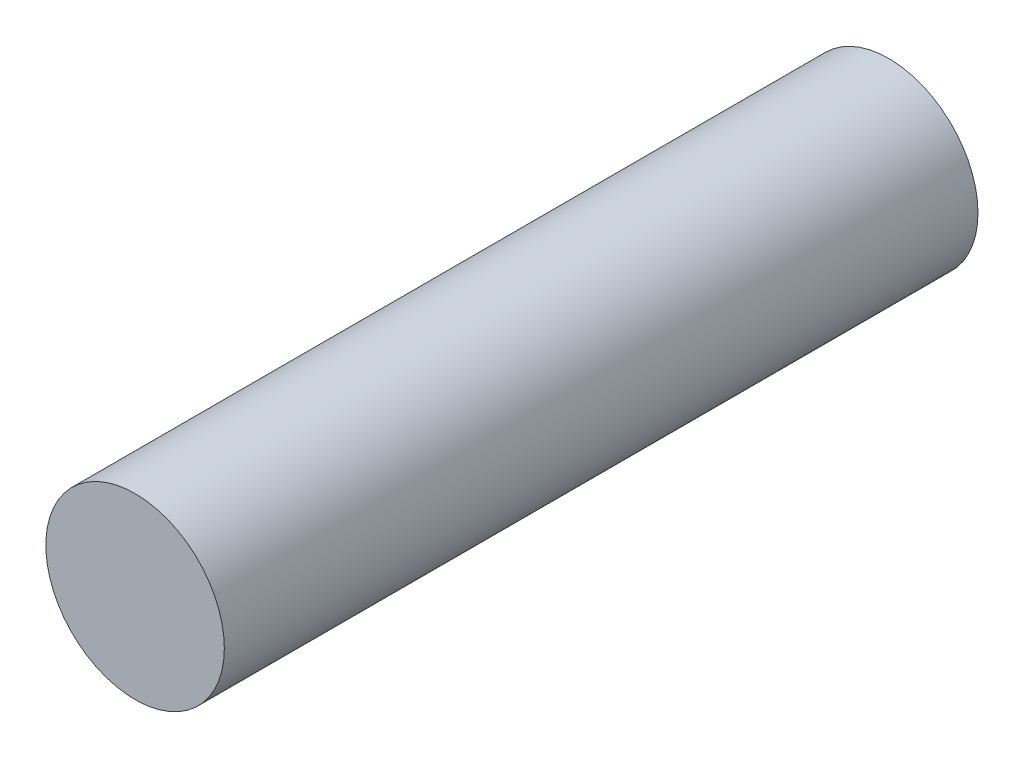
ISO-10303-21;
HEADER;
FILE_DESCRIPTION(('STEP AP214'),'2;1');
FILE_NAME('part.step','',(''),(''),'','','');
FILE_SCHEMA(('AUTOMOTIVE_DESIGN { 1 0 10303 214 1 1 1 1 }'));
ENDSEC;
DATA;
#1=APPLICATION_CONTEXT('core data for automotive mechanical design processes');
#2=APPLICATION_PROTOCOL_DEFINITION('international standard','automotive_design',2000,#1);
#3=PRODUCT_CONTEXT('',#1,'mechanical');
#4=PRODUCT('Part','Part','',(#3));
#5=PRODUCT_RELATED_PRODUCT_CATEGORY('part','',(#4));
#6=PRODUCT_DEFINITION_FORMATION('','',#4);
#7=PRODUCT_DEFINITION_CONTEXT('part definition',#1,'design');
#8=PRODUCT_DEFINITION('design','',#6,#7);
#9=PRODUCT_DEFINITION_SHAPE('','',#8);
#10=(LENGTH_UNIT() NAMED_UNIT(*) SI_UNIT(.MILLI.,.METRE.));
#11=(NAMED_UNIT(*) PLANE_ANGLE_UNIT() SI_UNIT($,.RADIAN.));
#12=(NAMED_UNIT(*) SI_UNIT($,.STERADIAN.) SOLID_ANGLE_UNIT());
#13=UNCERTAINTY_MEASURE_WITH_UNIT(LENGTH_MEASURE(1.E-05),#10,'distance_accuracy_value','');
#14=(GEOMETRIC_REPRESENTATION_CONTEXT(3) GLOBAL_UNCERTAINTY_ASSIGNED_CONTEXT((#13)) GLOBAL_UNIT_ASSIGNED_CONTEXT((#10,
#11,#12)) REPRESENTATION_CONTEXT('',''));
#15=CARTESIAN_POINT('',(0.,0.,0.));
#16=DIRECTION('',(0.,0.,1.));
#17=DIRECTION('',(1.,0.,0.));
#18=AXIS2_PLACEMENT_3D('',#15,#16,#17);
#19=CARTESIAN_POINT('',(0.,0.,76.));
#20=DIRECTION('',(0.,0.,-1.));
#21=DIRECTION('',(-1.,0.,0.));
#22=AXIS2_PLACEMENT_3D('',#19,#20,#21);
#23=CYLINDRICAL_SURFACE('',#22,9.);
#24=CARTESIAN_POINT('',(0.,0.,76.));
#25=DIRECTION('',(0.,0.,1.));
#26=DIRECTION('',(1.,0.,0.));
#27=AXIS2_PLACEMENT_3D('',#24,#25,#26);
#28=CIRCLE('',#27,9.);
#29=CARTESIAN_POINT('',(9.,0.,76.));
#30=VERTEX_POINT('',#29);
#31=EDGE_CURVE('E10',#30,#30,#28,.T.);
#32=ORIENTED_EDGE('',*,*,#31,.F.);
#33=EDGE_LOOP('',(#32));
#34=FACE_BOUND('',#33,.T.);
#35=CARTESIAN_POINT('',(0.,0.,0.));
#36=DIRECTION('',(0.,0.,1.));
#37=DIRECTION('',(1.,0.,0.));
#38=AXIS2_PLACEMENT_3D('',#35,#36,#37);
#39=CIRCLE('',#38,9.);
#40=CARTESIAN_POINT('',(9.,0.,0.));
#41=VERTEX_POINT('',#40);
#42=EDGE_CURVE('E46',#41,#41,#39,.T.);
#43=ORIENTED_EDGE('',*,*,#42,.T.);
#44=EDGE_LOOP('',(#43));
#45=FACE_BOUND('',#44,.T.);
#46=ADVANCED_FACE('F43',(#34,#45),#23,.T.);
#47=CARTESIAN_POINT('',(0.,0.,76.));
#48=DIRECTION('',(0.,0.,1.));
#49=DIRECTION('',(1.,0.,0.));
#50=AXIS2_PLACEMENT_3D('',#47,#48,#49);
#51=PLANE('',#50);
#52=ORIENTED_EDGE('',*,*,#31,.T.);
#53=EDGE_LOOP('',(#52));
#54=FACE_BOUND('',#53,.T.);
#55=ADVANCED_FACE('F60',(#54),#51,.T.);
#56=CARTESIAN_POINT('',(0.,0.,0.));
#57=DIRECTION('',(0.,0.,1.));
#58=DIRECTION('',(1.,0.,0.));
#59=AXIS2_PLACEMENT_3D('',#56,#57,#58);
#60=PLANE('',#59);
#61=ORIENTED_EDGE('',*,*,#42,.F.);
#62=EDGE_LOOP('',(#61));
#63=FACE_BOUND('',#62,.T.);
#64=ADVANCED_FACE('F58',(#63),#60,.F.);
#65=CLOSED_SHELL('',(#46,#55,#64));
#66=MANIFOLD_SOLID_BREP('B2',#65);
#67=ADVANCED_BREP_SHAPE_REPRESENTATION('',(#18,#66),#14);
#68=SHAPE_DEFINITION_REPRESENTATION(#9,#67);
ENDSEC;
END-ISO-10303-21;
